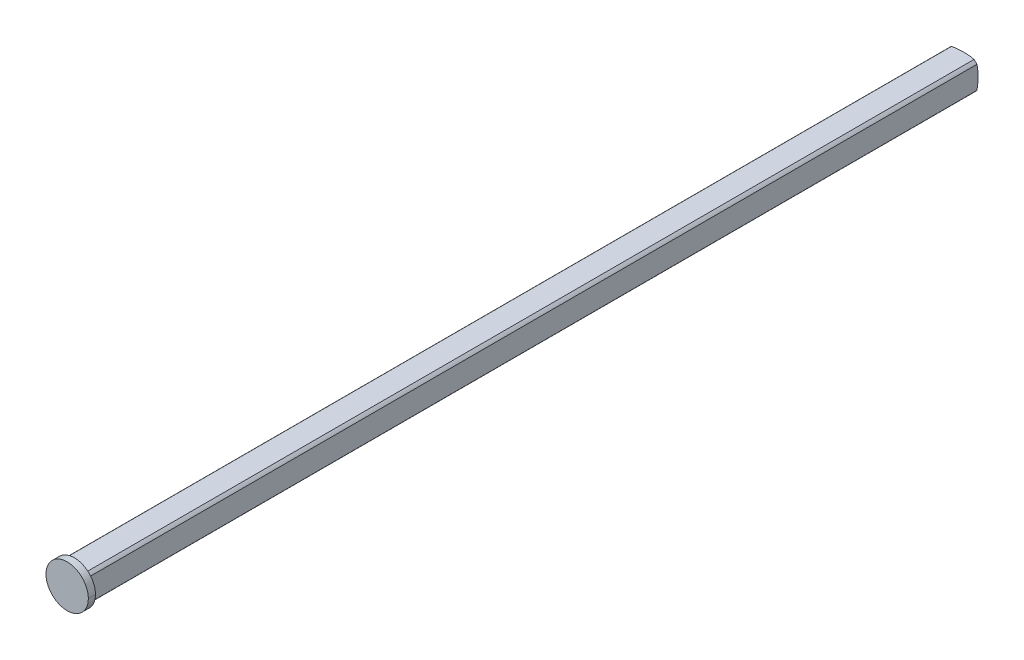
ISO-10303-21;
HEADER;
FILE_DESCRIPTION(('STEP AP214'),'2;1');
FILE_NAME('part.step','',(''),(''),'','','');
FILE_SCHEMA(('AUTOMOTIVE_DESIGN { 1 0 10303 214 1 1 1 1 }'));
ENDSEC;
DATA;
#1=APPLICATION_CONTEXT('core data for automotive mechanical design processes');
#2=APPLICATION_PROTOCOL_DEFINITION('international standard','automotive_design',2000,#1);
#3=PRODUCT_CONTEXT('',#1,'mechanical');
#4=PRODUCT('Part','Part','',(#3));
#5=PRODUCT_RELATED_PRODUCT_CATEGORY('part','',(#4));
#6=PRODUCT_DEFINITION_FORMATION('','',#4);
#7=PRODUCT_DEFINITION_CONTEXT('part definition',#1,'design');
#8=PRODUCT_DEFINITION('design','',#6,#7);
#9=PRODUCT_DEFINITION_SHAPE('','',#8);
#10=(LENGTH_UNIT() NAMED_UNIT(*) SI_UNIT(.MILLI.,.METRE.));
#11=(NAMED_UNIT(*) PLANE_ANGLE_UNIT() SI_UNIT($,.RADIAN.));
#12=(NAMED_UNIT(*) SI_UNIT($,.STERADIAN.) SOLID_ANGLE_UNIT());
#13=UNCERTAINTY_MEASURE_WITH_UNIT(LENGTH_MEASURE(1.E-05),#10,'distance_accuracy_value','');
#14=(GEOMETRIC_REPRESENTATION_CONTEXT(3) GLOBAL_UNCERTAINTY_ASSIGNED_CONTEXT((#13)) GLOBAL_UNIT_ASSIGNED_CONTEXT((#10,
#11,#12)) REPRESENTATION_CONTEXT('',''));
#15=CARTESIAN_POINT('',(0.,0.,0.));
#16=DIRECTION('',(0.,0.,1.));
#17=DIRECTION('',(1.,0.,0.));
#18=AXIS2_PLACEMENT_3D('',#15,#16,#17);
#19=CARTESIAN_POINT('',(0.,0.,0.));
#20=DIRECTION('',(0.,0.,1.));
#21=DIRECTION('',(1.,0.,0.));
#22=AXIS2_PLACEMENT_3D('',#19,#20,#21);
#23=PLANE('',#22);
#24=CARTESIAN_POINT('',(0.,0.,0.));
#25=DIRECTION('',(0.,0.,1.));
#26=DIRECTION('',(1.,0.,0.));
#27=AXIS2_PLACEMENT_3D('',#24,#25,#26);
#28=CIRCLE('',#27,2.375);
#29=CARTESIAN_POINT('',(-2.375,0.,0.));
#30=VERTEX_POINT('',#29);
#31=CARTESIAN_POINT('',(2.375,0.,0.));
#32=VERTEX_POINT('',#31);
#33=EDGE_CURVE('P0_E11',#30,#32,#28,.T.);
#34=ORIENTED_EDGE('',*,*,#33,.F.);
#35=CARTESIAN_POINT('',(0.,0.,0.));
#36=DIRECTION('',(0.,0.,1.));
#37=DIRECTION('',(1.,0.,0.));
#38=AXIS2_PLACEMENT_3D('',#35,#36,#37);
#39=CIRCLE('',#38,2.375);
#40=EDGE_CURVE('P0_E66',#32,#30,#39,.T.);
#41=ORIENTED_EDGE('',*,*,#40,.F.);
#42=EDGE_LOOP('',(#34,#41));
#43=FACE_BOUND('',#42,.T.);
#44=ADVANCED_FACE('P0_F17',(#43),#23,.F.);
#45=CARTESIAN_POINT('',(0.,0.,0.8));
#46=DIRECTION('',(0.,0.,1.));
#47=DIRECTION('',(1.,0.,0.));
#48=AXIS2_PLACEMENT_3D('',#45,#46,#47);
#49=PLANE('',#48);
#50=CARTESIAN_POINT('',(0.,0.,0.8));
#51=DIRECTION('',(0.,0.,1.));
#52=DIRECTION('',(1.,0.,0.));
#53=AXIS2_PLACEMENT_3D('',#50,#51,#52);
#54=CIRCLE('',#53,2.375);
#55=CARTESIAN_POINT('',(-2.375,0.,0.8));
#56=VERTEX_POINT('',#55);
#57=CARTESIAN_POINT('',(2.375,0.,0.8));
#58=VERTEX_POINT('',#57);
#59=EDGE_CURVE('P0_E29',#56,#58,#54,.T.);
#60=ORIENTED_EDGE('',*,*,#59,.T.);
#61=CARTESIAN_POINT('',(0.,0.,0.8));
#62=DIRECTION('',(0.,0.,1.));
#63=DIRECTION('',(1.,0.,0.));
#64=AXIS2_PLACEMENT_3D('',#61,#62,#63);
#65=CIRCLE('',#64,2.375);
#66=EDGE_CURVE('P0_E65',#58,#56,#65,.T.);
#67=ORIENTED_EDGE('',*,*,#66,.T.);
#68=EDGE_LOOP('',(#60,#67));
#69=FACE_BOUND('',#68,.T.);
#70=ADVANCED_FACE('P0_F19',(#69),#49,.T.);
#71=CARTESIAN_POINT('',(0.,0.,0.8));
#72=DIRECTION('',(0.,0.,-1.));
#73=DIRECTION('',(-1.,0.,0.));
#74=AXIS2_PLACEMENT_3D('',#71,#72,#73);
#75=CYLINDRICAL_SURFACE('',#74,2.375);
#76=DIRECTION('',(0.,0.,-1.));
#77=VECTOR('',#76,1.);
#78=CARTESIAN_POINT('',(2.375,0.,0.8));
#79=LINE('',#78,#77);
#80=EDGE_CURVE('P0_E21',#58,#32,#79,.T.);
#81=ORIENTED_EDGE('',*,*,#80,.F.);
#82=ORIENTED_EDGE('',*,*,#59,.F.);
#83=DIRECTION('',(0.,0.,-1.));
#84=VECTOR('',#83,1.);
#85=CARTESIAN_POINT('',(-2.375,0.,0.8));
#86=LINE('',#85,#84);
#87=EDGE_CURVE('P0_E59',#56,#30,#86,.T.);
#88=ORIENTED_EDGE('',*,*,#87,.T.);
#89=ORIENTED_EDGE('',*,*,#33,.T.);
#90=EDGE_LOOP('',(#81,#82,#88,#89));
#91=FACE_BOUND('',#90,.T.);
#92=ADVANCED_FACE('P0_F60',(#91),#75,.T.);
#93=CARTESIAN_POINT('',(0.,0.,0.8));
#94=DIRECTION('',(0.,0.,-1.));
#95=DIRECTION('',(-1.,0.,0.));
#96=AXIS2_PLACEMENT_3D('',#93,#94,#95);
#97=CYLINDRICAL_SURFACE('',#96,2.375);
#98=ORIENTED_EDGE('',*,*,#66,.F.);
#99=ORIENTED_EDGE('',*,*,#80,.T.);
#100=ORIENTED_EDGE('',*,*,#40,.T.);
#101=ORIENTED_EDGE('',*,*,#87,.F.);
#102=EDGE_LOOP('',(#98,#99,#100,#101));
#103=FACE_BOUND('',#102,.T.);
#104=ADVANCED_FACE('P0_F63',(#103),#97,.T.);
#105=CLOSED_SHELL('',(#44,#70,#92,#104));
#106=MANIFOLD_SOLID_BREP('P0_B1',#105);
#107=CARTESIAN_POINT('',(0.,0.,-99.822));
#108=DIRECTION('',(0.,0.,1.));
#109=DIRECTION('',(1.,0.,0.));
#110=AXIS2_PLACEMENT_3D('',#107,#108,#109);
#111=CYLINDRICAL_SURFACE('',#110,2.032);
#112=DIRECTION('',(0.,0.,-1.));
#113=VECTOR('',#112,1.);
#114=CARTESIAN_POINT('',(1.5875,1.26841150657032,-99.822));
#115=LINE('',#114,#113);
#116=CARTESIAN_POINT('',(1.5875,1.26841150657032,0.));
#117=VERTEX_POINT('',#116);
#118=CARTESIAN_POINT('',(1.5875,1.26841150657032,-99.670919142098));
#119=VERTEX_POINT('',#118);
#120=EDGE_CURVE('P1_E416',#117,#119,#115,.T.);
#121=ORIENTED_EDGE('',*,*,#120,.T.);
#122=CARTESIAN_POINT('',(0.,0.,-99.670919142098));
#123=DIRECTION('',(0.,0.,1.));
#124=DIRECTION('',(1.,0.,0.));
#125=AXIS2_PLACEMENT_3D('',#122,#123,#124);
#126=CIRCLE('',#125,2.032);
#127=CARTESIAN_POINT('',(1.26841150657032,1.5875,-99.670919142098));
#128=VERTEX_POINT('',#127);
#129=EDGE_CURVE('P1_E252',#119,#128,#126,.T.);
#130=ORIENTED_EDGE('',*,*,#129,.T.);
#131=DIRECTION('',(0.,0.,1.));
#132=VECTOR('',#131,1.);
#133=CARTESIAN_POINT('',(1.26841150657032,1.5875,-99.822));
#134=LINE('',#133,#132);
#135=CARTESIAN_POINT('',(1.26841150657032,1.5875,0.));
#136=VERTEX_POINT('',#135);
#137=EDGE_CURVE('P1_E221',#128,#136,#134,.T.);
#138=ORIENTED_EDGE('',*,*,#137,.T.);
#139=CARTESIAN_POINT('',(0.,0.,0.));
#140=DIRECTION('',(0.,0.,1.));
#141=DIRECTION('',(1.,0.,0.));
#142=AXIS2_PLACEMENT_3D('',#139,#140,#141);
#143=CIRCLE('',#142,2.032);
#144=EDGE_CURVE('P1_E360',#117,#136,#143,.T.);
#145=ORIENTED_EDGE('',*,*,#144,.F.);
#146=EDGE_LOOP('',(#121,#130,#138,#145));
#147=FACE_BOUND('',#146,.T.);
#148=ADVANCED_FACE('P1_F16',(#147),#111,.T.);
#149=CARTESIAN_POINT('',(0.,0.,-99.822));
#150=DIRECTION('',(0.,0.,1.));
#151=DIRECTION('',(1.,0.,0.));
#152=AXIS2_PLACEMENT_3D('',#149,#150,#151);
#153=CYLINDRICAL_SURFACE('',#152,2.032);
#154=DIRECTION('',(0.,0.,1.));
#155=VECTOR('',#154,1.);
#156=CARTESIAN_POINT('',(-1.5875,1.26841150657032,-99.822));
#157=LINE('',#156,#155);
#158=CARTESIAN_POINT('',(-1.5875,1.26841150657032,-99.670919142098));
#159=VERTEX_POINT('',#158);
#160=CARTESIAN_POINT('',(-1.5875,1.26841150657032,0.));
#161=VERTEX_POINT('',#160);
#162=EDGE_CURVE('P1_E199',#159,#161,#157,.T.);
#163=ORIENTED_EDGE('',*,*,#162,.T.);
#164=CARTESIAN_POINT('',(0.,0.,0.));
#165=DIRECTION('',(0.,0.,1.));
#166=DIRECTION('',(1.,0.,0.));
#167=AXIS2_PLACEMENT_3D('',#164,#165,#166);
#168=CIRCLE('',#167,2.032);
#169=CARTESIAN_POINT('',(-1.26841150657032,1.5875,0.));
#170=VERTEX_POINT('',#169);
#171=EDGE_CURVE('P1_E43',#170,#161,#168,.T.);
#172=ORIENTED_EDGE('',*,*,#171,.F.);
#173=DIRECTION('',(0.,0.,-1.));
#174=VECTOR('',#173,1.);
#175=CARTESIAN_POINT('',(-1.26841150657032,1.5875,-99.822));
#176=LINE('',#175,#174);
#177=CARTESIAN_POINT('',(-1.26841150657032,1.5875,-99.670919142098));
#178=VERTEX_POINT('',#177);
#179=EDGE_CURVE('P1_E233',#170,#178,#176,.T.);
#180=ORIENTED_EDGE('',*,*,#179,.T.);
#181=CARTESIAN_POINT('',(0.,0.,-99.670919142098));
#182=DIRECTION('',(0.,0.,1.));
#183=DIRECTION('',(1.,0.,0.));
#184=AXIS2_PLACEMENT_3D('',#181,#182,#183);
#185=CIRCLE('',#184,2.032);
#186=EDGE_CURVE('P1_E245',#178,#159,#185,.T.);
#187=ORIENTED_EDGE('',*,*,#186,.T.);
#188=EDGE_LOOP('',(#163,#172,#180,#187));
#189=FACE_BOUND('',#188,.T.);
#190=ADVANCED_FACE('P1_F350',(#189),#153,.T.);
#191=CARTESIAN_POINT('',(0.,0.,-99.822));
#192=DIRECTION('',(0.,0.,1.));
#193=DIRECTION('',(1.,0.,0.));
#194=AXIS2_PLACEMENT_3D('',#191,#192,#193);
#195=CYLINDRICAL_SURFACE('',#194,2.032);
#196=DIRECTION('',(0.,0.,-1.));
#197=VECTOR('',#196,1.);
#198=CARTESIAN_POINT('',(-1.5875,-1.26841150657032,-99.822));
#199=LINE('',#198,#197);
#200=CARTESIAN_POINT('',(-1.5875,-1.26841150657032,0.));
#201=VERTEX_POINT('',#200);
#202=CARTESIAN_POINT('',(-1.5875,-1.26841150657032,-99.670919142098));
#203=VERTEX_POINT('',#202);
#204=EDGE_CURVE('P1_E145',#201,#203,#199,.T.);
#205=ORIENTED_EDGE('',*,*,#204,.T.);
#206=CARTESIAN_POINT('',(0.,0.,-99.670919142098));
#207=DIRECTION('',(0.,0.,1.));
#208=DIRECTION('',(1.,0.,0.));
#209=AXIS2_PLACEMENT_3D('',#206,#207,#208);
#210=CIRCLE('',#209,2.032);
#211=CARTESIAN_POINT('',(-1.26841150657032,-1.5875,-99.670919142098));
#212=VERTEX_POINT('',#211);
#213=EDGE_CURVE('P1_E10',#203,#212,#210,.T.);
#214=ORIENTED_EDGE('',*,*,#213,.T.);
#215=DIRECTION('',(0.,0.,1.));
#216=VECTOR('',#215,1.);
#217=CARTESIAN_POINT('',(-1.26841150657032,-1.5875,-99.822));
#218=LINE('',#217,#216);
#219=CARTESIAN_POINT('',(-1.26841150657032,-1.5875,0.));
#220=VERTEX_POINT('',#219);
#221=EDGE_CURVE('P1_E126',#212,#220,#218,.T.);
#222=ORIENTED_EDGE('',*,*,#221,.T.);
#223=CARTESIAN_POINT('',(0.,0.,0.));
#224=DIRECTION('',(0.,0.,1.));
#225=DIRECTION('',(1.,0.,0.));
#226=AXIS2_PLACEMENT_3D('',#223,#224,#225);
#227=CIRCLE('',#226,2.032);
#228=EDGE_CURVE('P1_E108',#201,#220,#227,.T.);
#229=ORIENTED_EDGE('',*,*,#228,.F.);
#230=EDGE_LOOP('',(#205,#214,#222,#229));
#231=FACE_BOUND('',#230,.T.);
#232=ADVANCED_FACE('P1_F132',(#231),#195,.T.);
#233=CARTESIAN_POINT('',(0.,0.,-99.822));
#234=DIRECTION('',(0.,0.,1.));
#235=DIRECTION('',(1.,0.,0.));
#236=AXIS2_PLACEMENT_3D('',#233,#234,#235);
#237=CYLINDRICAL_SURFACE('',#236,2.032);
#238=DIRECTION('',(0.,0.,-1.));
#239=VECTOR('',#238,1.);
#240=CARTESIAN_POINT('',(1.26841150657032,-1.5875,-99.822));
#241=LINE('',#240,#239);
#242=CARTESIAN_POINT('',(1.26841150657032,-1.5875,0.));
#243=VERTEX_POINT('',#242);
#244=CARTESIAN_POINT('',(1.26841150657032,-1.5875,-99.670919142098));
#245=VERTEX_POINT('',#244);
#246=EDGE_CURVE('P1_E127',#243,#245,#241,.T.);
#247=ORIENTED_EDGE('',*,*,#246,.T.);
#248=CARTESIAN_POINT('',(0.,0.,-99.670919142098));
#249=DIRECTION('',(0.,0.,1.));
#250=DIRECTION('',(1.,0.,0.));
#251=AXIS2_PLACEMENT_3D('',#248,#249,#250);
#252=CIRCLE('',#251,2.032);
#253=CARTESIAN_POINT('',(1.5875,-1.26841150657032,-99.670919142098));
#254=VERTEX_POINT('',#253);
#255=EDGE_CURVE('P1_E29',#245,#254,#252,.T.);
#256=ORIENTED_EDGE('',*,*,#255,.T.);
#257=DIRECTION('',(0.,0.,1.));
#258=VECTOR('',#257,1.);
#259=CARTESIAN_POINT('',(1.5875,-1.26841150657032,-99.822));
#260=LINE('',#259,#258);
#261=CARTESIAN_POINT('',(1.5875,-1.26841150657032,0.));
#262=VERTEX_POINT('',#261);
#263=EDGE_CURVE('P1_E131',#254,#262,#260,.T.);
#264=ORIENTED_EDGE('',*,*,#263,.T.);
#265=CARTESIAN_POINT('',(0.,0.,0.));
#266=DIRECTION('',(0.,0.,1.));
#267=DIRECTION('',(1.,0.,0.));
#268=AXIS2_PLACEMENT_3D('',#265,#266,#267);
#269=CIRCLE('',#268,2.032);
#270=EDGE_CURVE('P1_E121',#243,#262,#269,.T.);
#271=ORIENTED_EDGE('',*,*,#270,.F.);
#272=EDGE_LOOP('',(#247,#256,#264,#271));
#273=FACE_BOUND('',#272,.T.);
#274=ADVANCED_FACE('P1_F439',(#273),#237,.T.);
#275=CARTESIAN_POINT('',(-1.5875,1.5875,-99.822));
#276=DIRECTION('',(0.,0.,-1.));
#277=DIRECTION('',(0.,-1.,0.));
#278=AXIS2_PLACEMENT_3D('',#275,#276,#277);
#279=PLANE('',#278);
#280=CARTESIAN_POINT('',(0.,0.,-99.822));
#281=DIRECTION('',(0.,0.,1.));
#282=DIRECTION('',(1.,0.,0.));
#283=AXIS2_PLACEMENT_3D('',#280,#281,#282);
#284=CIRCLE('',#283,1.24506403026729);
#285=CARTESIAN_POINT('',(1.24506403026729,0.,-99.822));
#286=VERTEX_POINT('',#285);
#287=CARTESIAN_POINT('',(-1.24506403026729,0.,-99.822));
#288=VERTEX_POINT('',#287);
#289=EDGE_CURVE('P1_E259',#286,#288,#284,.T.);
#290=ORIENTED_EDGE('',*,*,#289,.F.);
#291=CARTESIAN_POINT('',(0.,0.,-99.822));
#292=DIRECTION('',(0.,0.,1.));
#293=DIRECTION('',(1.,0.,0.));
#294=AXIS2_PLACEMENT_3D('',#291,#292,#293);
#295=CIRCLE('',#294,1.24506403026729);
#296=EDGE_CURVE('P1_E331',#288,#286,#295,.T.);
#297=ORIENTED_EDGE('',*,*,#296,.F.);
#298=EDGE_LOOP('',(#290,#297));
#299=FACE_BOUND('',#298,.T.);
#300=ADVANCED_FACE('P1_F176',(#299),#279,.T.);
#301=CARTESIAN_POINT('',(0.,0.,-97.697));
#302=DIRECTION('',(0.,0.,1.));
#303=DIRECTION('',(1.,0.,0.));
#304=AXIS2_PLACEMENT_3D('',#301,#302,#303);
#305=DEGENERATE_TOROIDAL_SURFACE('',#304,1.24506403026729,2.125,.T.);
#306=CARTESIAN_POINT('',(-1.24506403026729,0.,-97.697));
#307=DIRECTION('',(0.,1.,0.));
#308=DIRECTION('',(-1.,0.,0.));
#309=AXIS2_PLACEMENT_3D('',#306,#307,#308);
#310=CIRCLE('',#309,2.125);
#311=CARTESIAN_POINT('',(-1.5875,0.,-99.7942273616929));
#312=VERTEX_POINT('',#311);
#313=EDGE_CURVE('P1_E255',#288,#312,#310,.T.);
#314=ORIENTED_EDGE('',*,*,#313,.F.);
#315=ORIENTED_EDGE('',*,*,#296,.T.);
#316=CARTESIAN_POINT('',(1.24506403026729,0.,-97.697));
#317=DIRECTION('',(0.,-1.,0.));
#318=DIRECTION('',(0.,0.,-1.));
#319=AXIS2_PLACEMENT_3D('',#316,#317,#318);
#320=CIRCLE('',#319,2.125);
#321=CARTESIAN_POINT('',(1.5875,0.,-99.7942273616929));
#322=VERTEX_POINT('',#321);
#323=EDGE_CURVE('P1_E293',#286,#322,#320,.T.);
#324=ORIENTED_EDGE('',*,*,#323,.T.);
#325=CARTESIAN_POINT('',(1.5875,-1.26841150657032,-99.670919142098));
#326=CARTESIAN_POINT('',(1.5875,-0.987077094955291,-99.7409306391243));
#327=CARTESIAN_POINT('',(1.5875,-0.639530459017568,-99.7701819538896));
#328=CARTESIAN_POINT('',(1.5875,-0.353837297572158,-99.7942273616929));
#329=CARTESIAN_POINT('',(1.5875,0.,-99.7942273616929));
#330=B_SPLINE_CURVE_WITH_KNOTS('',2,(#325,#326,#327,#328,#329),.UNSPECIFIED.,.F.,.F.,(3,2,3),
(0.,0.5,1.),.UNSPECIFIED.);
#331=EDGE_CURVE('P1_E362',#254,#322,#330,.T.);
#332=ORIENTED_EDGE('',*,*,#331,.F.);
#333=ORIENTED_EDGE('',*,*,#255,.F.);
#334=CARTESIAN_POINT('',(-1.26841150657032,-1.5875,-99.670919142098));
#335=CARTESIAN_POINT('',(-0.770338232200978,-1.5875,-99.7948672057821));
#336=CARTESIAN_POINT('',(0.00849337593367507,-1.5875,-99.7942236517902));
#337=CARTESIAN_POINT('',(0.77547099040796,-1.5875,-99.793589892836));
#338=CARTESIAN_POINT('',(1.26841150657033,-1.5875,-99.670919142098));
#339=B_SPLINE_CURVE_WITH_KNOTS('',2,(#334,#335,#336,#337,#338),.UNSPECIFIED.,.F.,.F.,(3,2,3),
(0.,0.5,1.),.UNSPECIFIED.);
#340=EDGE_CURVE('P1_E136',#212,#245,#339,.T.);
#341=ORIENTED_EDGE('',*,*,#340,.F.);
#342=ORIENTED_EDGE('',*,*,#213,.F.);
#343=CARTESIAN_POINT('',(-1.5875,0.,-99.7942273616929));
#344=CARTESIAN_POINT('',(-1.5875,-0.353179957370062,-99.7942273616929));
#345=CARTESIAN_POINT('',(-1.5875,-0.639529322286498,-99.7701820494506));
#346=CARTESIAN_POINT('',(-1.5875,-0.986669843225674,-99.741031985785));
#347=CARTESIAN_POINT('',(-1.5875,-1.26841150657032,-99.670919142098));
#348=B_SPLINE_CURVE_WITH_KNOTS('',2,(#343,#344,#345,#346,#347),.UNSPECIFIED.,.F.,.F.,(3,2,3),
(0.,0.5,1.),.UNSPECIFIED.);
#349=EDGE_CURVE('P1_E159',#312,#203,#348,.T.);
#350=ORIENTED_EDGE('',*,*,#349,.F.);
#351=EDGE_LOOP('',(#314,#315,#324,#332,#333,#341,#342,#350));
#352=FACE_BOUND('',#351,.T.);
#353=ADVANCED_FACE('P1_F338',(#352),#305,.T.);
#354=CARTESIAN_POINT('',(-1.5875,1.5875,0.));
#355=DIRECTION('',(0.,0.,-1.));
#356=DIRECTION('',(0.,-1.,0.));
#357=AXIS2_PLACEMENT_3D('',#354,#355,#356);
#358=PLANE('',#357);
#359=ORIENTED_EDGE('',*,*,#171,.T.);
#360=DIRECTION('',(0.,-1.,0.));
#361=VECTOR('',#360,1.);
#362=CARTESIAN_POINT('',(-1.5875,-1.5875,0.));
#363=LINE('',#362,#361);
#364=EDGE_CURVE('P1_E113',#161,#201,#363,.T.);
#365=ORIENTED_EDGE('',*,*,#364,.T.);
#366=ORIENTED_EDGE('',*,*,#228,.T.);
#367=DIRECTION('',(1.,0.,0.));
#368=VECTOR('',#367,1.);
#369=CARTESIAN_POINT('',(-1.5875,-1.5875,0.));
#370=LINE('',#369,#368);
#371=EDGE_CURVE('P1_E115',#220,#243,#370,.T.);
#372=ORIENTED_EDGE('',*,*,#371,.T.);
#373=ORIENTED_EDGE('',*,*,#270,.T.);
#374=DIRECTION('',(0.,1.,0.));
#375=VECTOR('',#374,1.);
#376=CARTESIAN_POINT('',(1.5875,-1.5875,0.));
#377=LINE('',#376,#375);
#378=EDGE_CURVE('P1_E232',#262,#117,#377,.T.);
#379=ORIENTED_EDGE('',*,*,#378,.T.);
#380=ORIENTED_EDGE('',*,*,#144,.T.);
#381=DIRECTION('',(-1.,0.,0.));
#382=VECTOR('',#381,1.);
#383=CARTESIAN_POINT('',(-1.5875,1.5875,0.));
#384=LINE('',#383,#382);
#385=EDGE_CURVE('P1_E237',#136,#170,#384,.T.);
#386=ORIENTED_EDGE('',*,*,#385,.T.);
#387=EDGE_LOOP('',(#359,#365,#366,#372,#373,#379,#380,#386));
#388=FACE_BOUND('',#387,.T.);
#389=ADVANCED_FACE('P1_F112',(#388),#358,.F.);
#390=CARTESIAN_POINT('',(-1.5875,1.5875,0.));
#391=DIRECTION('',(0.,-1.,0.));
#392=DIRECTION('',(0.,0.,-1.));
#393=AXIS2_PLACEMENT_3D('',#390,#391,#392);
#394=PLANE('',#393);
#395=ORIENTED_EDGE('',*,*,#137,.F.);
#396=CARTESIAN_POINT('',(1.26841150657033,1.5875,-99.670919142098));
#397=CARTESIAN_POINT('',(0.77033823220098,1.5875,-99.7948672057821));
#398=CARTESIAN_POINT('',(-0.00849337593367486,1.5875,-99.7942236517902));
#399=CARTESIAN_POINT('',(-0.775470990407961,1.5875,-99.793589892836));
#400=CARTESIAN_POINT('',(-1.26841150657032,1.5875,-99.670919142098));
#401=B_SPLINE_CURVE_WITH_KNOTS('',2,(#396,#397,#398,#399,#400),.UNSPECIFIED.,.F.,.F.,(3,2,3),
(0.,0.5,1.),.UNSPECIFIED.);
#402=EDGE_CURVE('P1_E244',#128,#178,#401,.T.);
#403=ORIENTED_EDGE('',*,*,#402,.T.);
#404=ORIENTED_EDGE('',*,*,#179,.F.);
#405=ORIENTED_EDGE('',*,*,#385,.F.);
#406=EDGE_LOOP('',(#395,#403,#404,#405));
#407=FACE_BOUND('',#406,.T.);
#408=ADVANCED_FACE('P1_F178',(#407),#394,.F.);
#409=CARTESIAN_POINT('',(1.5875,-1.5875,0.));
#410=DIRECTION('',(-1.,0.,0.));
#411=DIRECTION('',(0.,0.,1.));
#412=AXIS2_PLACEMENT_3D('',#409,#410,#411);
#413=PLANE('',#412);
#414=ORIENTED_EDGE('',*,*,#263,.F.);
#415=ORIENTED_EDGE('',*,*,#331,.T.);
#416=CARTESIAN_POINT('',(1.5875,0.,-99.7942273616929));
#417=CARTESIAN_POINT('',(1.5875,0.35317995737012,-99.7942273616929));
#418=CARTESIAN_POINT('',(1.5875,0.6395293222865,-99.7701820494506));
#419=CARTESIAN_POINT('',(1.5875,0.98666984322571,-99.7410319857849));
#420=CARTESIAN_POINT('',(1.5875,1.26841150657033,-99.670919142098));
#421=B_SPLINE_CURVE_WITH_KNOTS('',2,(#416,#417,#418,#419,#420),.UNSPECIFIED.,.F.,.F.,(3,2,3),
(0.,0.5,1.),.UNSPECIFIED.);
#422=EDGE_CURVE('P1_E282',#322,#119,#421,.T.);
#423=ORIENTED_EDGE('',*,*,#422,.T.);
#424=ORIENTED_EDGE('',*,*,#120,.F.);
#425=ORIENTED_EDGE('',*,*,#378,.F.);
#426=EDGE_LOOP('',(#414,#415,#423,#424,#425));
#427=FACE_BOUND('',#426,.T.);
#428=ADVANCED_FACE('P1_F18',(#427),#413,.F.);
#429=CARTESIAN_POINT('',(-1.5875,-1.5875,0.));
#430=DIRECTION('',(0.,1.,0.));
#431=DIRECTION('',(1.,0.,0.));
#432=AXIS2_PLACEMENT_3D('',#429,#430,#431);
#433=PLANE('',#432);
#434=ORIENTED_EDGE('',*,*,#221,.F.);
#435=ORIENTED_EDGE('',*,*,#340,.T.);
#436=ORIENTED_EDGE('',*,*,#246,.F.);
#437=ORIENTED_EDGE('',*,*,#371,.F.);
#438=EDGE_LOOP('',(#434,#435,#436,#437));
#439=FACE_BOUND('',#438,.T.);
#440=ADVANCED_FACE('P1_F124',(#439),#433,.F.);
#441=CARTESIAN_POINT('',(-1.5875,-1.5875,0.));
#442=DIRECTION('',(1.,0.,0.));
#443=DIRECTION('',(0.,1.,0.));
#444=AXIS2_PLACEMENT_3D('',#441,#442,#443);
#445=PLANE('',#444);
#446=ORIENTED_EDGE('',*,*,#162,.F.);
#447=CARTESIAN_POINT('',(-1.5875,1.26841150657033,-99.670919142098));
#448=CARTESIAN_POINT('',(-1.5875,0.98707709495531,-99.7409306391242));
#449=CARTESIAN_POINT('',(-1.5875,0.63953045901757,-99.7701819538896));
#450=CARTESIAN_POINT('',(-1.5875,0.353837297572185,-99.7942273616929));
#451=CARTESIAN_POINT('',(-1.5875,0.,-99.7942273616929));
#452=B_SPLINE_CURVE_WITH_KNOTS('',2,(#447,#448,#449,#450,#451),.UNSPECIFIED.,.F.,.F.,(3,2,3),
(0.,0.5,1.),.UNSPECIFIED.);
#453=EDGE_CURVE('P1_E197',#159,#312,#452,.T.);
#454=ORIENTED_EDGE('',*,*,#453,.T.);
#455=ORIENTED_EDGE('',*,*,#349,.T.);
#456=ORIENTED_EDGE('',*,*,#204,.F.);
#457=ORIENTED_EDGE('',*,*,#364,.F.);
#458=EDGE_LOOP('',(#446,#454,#455,#456,#457));
#459=FACE_BOUND('',#458,.T.);
#460=ADVANCED_FACE('P1_F167',(#459),#445,.F.);
#461=CARTESIAN_POINT('',(0.,0.,-97.697));
#462=DIRECTION('',(0.,0.,1.));
#463=DIRECTION('',(1.,0.,0.));
#464=AXIS2_PLACEMENT_3D('',#461,#462,#463);
#465=DEGENERATE_TOROIDAL_SURFACE('',#464,1.24506403026729,2.125,.T.);
#466=ORIENTED_EDGE('',*,*,#289,.T.);
#467=ORIENTED_EDGE('',*,*,#313,.T.);
#468=ORIENTED_EDGE('',*,*,#453,.F.);
#469=ORIENTED_EDGE('',*,*,#186,.F.);
#470=ORIENTED_EDGE('',*,*,#402,.F.);
#471=ORIENTED_EDGE('',*,*,#129,.F.);
#472=ORIENTED_EDGE('',*,*,#422,.F.);
#473=ORIENTED_EDGE('',*,*,#323,.F.);
#474=EDGE_LOOP('',(#466,#467,#468,#469,#470,#471,#472,#473));
#475=FACE_BOUND('',#474,.T.);
#476=ADVANCED_FACE('P1_F175',(#475),#465,.T.);
#477=CLOSED_SHELL('',(#148,#190,#232,#274,#300,#353,#389,#408,#428,#440,#460,#476));
#478=MANIFOLD_SOLID_BREP('P1_B1',#477);
#479=ADVANCED_BREP_SHAPE_REPRESENTATION('',(#18,#106,#478),#14);
#480=SHAPE_DEFINITION_REPRESENTATION(#9,#479);
ENDSEC;
END-ISO-10303-21;
